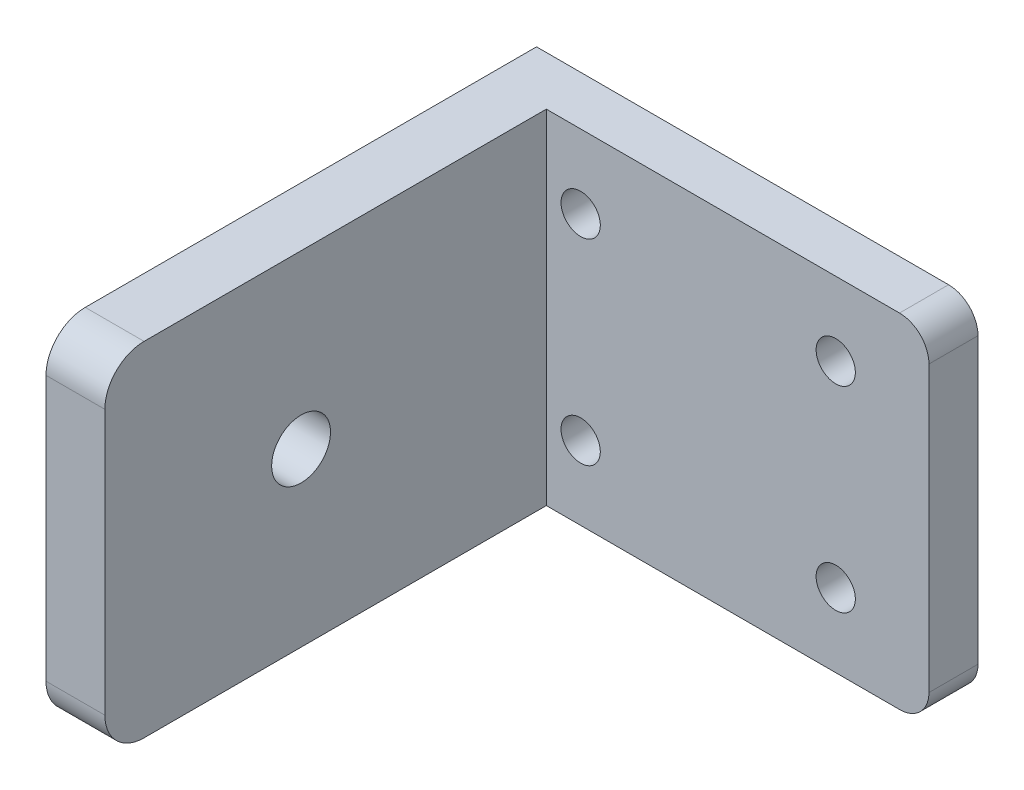
ISO-10303-21;
HEADER;
FILE_DESCRIPTION(('STEP AP214'),'2;1');
FILE_NAME('part.step','',(''),(''),'','','');
FILE_SCHEMA(('AUTOMOTIVE_DESIGN { 1 0 10303 214 1 1 1 1 }'));
ENDSEC;
DATA;
#1=APPLICATION_CONTEXT('core data for automotive mechanical design processes');
#2=APPLICATION_PROTOCOL_DEFINITION('international standard','automotive_design',2000,#1);
#3=PRODUCT_CONTEXT('',#1,'mechanical');
#4=PRODUCT('Part','Part','',(#3));
#5=PRODUCT_RELATED_PRODUCT_CATEGORY('part','',(#4));
#6=PRODUCT_DEFINITION_FORMATION('','',#4);
#7=PRODUCT_DEFINITION_CONTEXT('part definition',#1,'design');
#8=PRODUCT_DEFINITION('design','',#6,#7);
#9=PRODUCT_DEFINITION_SHAPE('','',#8);
#10=(LENGTH_UNIT() NAMED_UNIT(*) SI_UNIT(.MILLI.,.METRE.));
#11=(NAMED_UNIT(*) PLANE_ANGLE_UNIT() SI_UNIT($,.RADIAN.));
#12=(NAMED_UNIT(*) SI_UNIT($,.STERADIAN.) SOLID_ANGLE_UNIT());
#13=UNCERTAINTY_MEASURE_WITH_UNIT(LENGTH_MEASURE(1.E-05),#10,'distance_accuracy_value','');
#14=(GEOMETRIC_REPRESENTATION_CONTEXT(3) GLOBAL_UNCERTAINTY_ASSIGNED_CONTEXT((#13)) GLOBAL_UNIT_ASSIGNED_CONTEXT((#10,
#11,#12)) REPRESENTATION_CONTEXT('',''));
#15=CARTESIAN_POINT('',(0.,0.,0.));
#16=DIRECTION('',(0.,0.,1.));
#17=DIRECTION('',(1.,0.,0.));
#18=AXIS2_PLACEMENT_3D('',#15,#16,#17);
#19=CARTESIAN_POINT('',(0.,0.,5.));
#20=DIRECTION('',(0.,0.,-1.));
#21=DIRECTION('',(-1.,0.,0.));
#22=AXIS2_PLACEMENT_3D('',#19,#20,#21);
#23=PLANE('',#22);
#24=CARTESIAN_POINT('',(-13.,10.,5.));
#25=DIRECTION('',(0.,0.,-1.));
#26=DIRECTION('',(-1.,0.,0.));
#27=AXIS2_PLACEMENT_3D('',#24,#25,#26);
#28=CIRCLE('',#27,2.);
#29=CARTESIAN_POINT('',(-15.,10.,5.));
#30=VERTEX_POINT('',#29);
#31=EDGE_CURVE('E368',#30,#30,#28,.F.);
#32=ORIENTED_EDGE('',*,*,#31,.F.);
#33=EDGE_LOOP('',(#32));
#34=FACE_BOUND('',#33,.T.);
#35=CARTESIAN_POINT('',(13.,-10.,5.));
#36=DIRECTION('',(0.,0.,-1.));
#37=DIRECTION('',(-1.,0.,0.));
#38=AXIS2_PLACEMENT_3D('',#35,#36,#37);
#39=CIRCLE('',#38,2.);
#40=CARTESIAN_POINT('',(11.,-10.,5.));
#41=VERTEX_POINT('',#40);
#42=EDGE_CURVE('E369',#41,#41,#39,.F.);
#43=ORIENTED_EDGE('',*,*,#42,.F.);
#44=EDGE_LOOP('',(#43));
#45=FACE_BOUND('',#44,.T.);
#46=CARTESIAN_POINT('',(-13.,-10.,5.));
#47=DIRECTION('',(0.,0.,-1.));
#48=DIRECTION('',(-1.,0.,0.));
#49=AXIS2_PLACEMENT_3D('',#46,#47,#48);
#50=CIRCLE('',#49,2.);
#51=CARTESIAN_POINT('',(-15.,-10.,5.));
#52=VERTEX_POINT('',#51);
#53=EDGE_CURVE('E378',#52,#52,#50,.F.);
#54=ORIENTED_EDGE('',*,*,#53,.F.);
#55=EDGE_LOOP('',(#54));
#56=FACE_BOUND('',#55,.T.);
#57=CARTESIAN_POINT('',(13.,10.,5.));
#58=DIRECTION('',(0.,0.,-1.));
#59=DIRECTION('',(-1.,0.,0.));
#60=AXIS2_PLACEMENT_3D('',#57,#58,#59);
#61=CIRCLE('',#60,2.);
#62=CARTESIAN_POINT('',(11.,10.,5.));
#63=VERTEX_POINT('',#62);
#64=EDGE_CURVE('E356',#63,#63,#61,.F.);
#65=ORIENTED_EDGE('',*,*,#64,.F.);
#66=EDGE_LOOP('',(#65));
#67=FACE_BOUND('',#66,.T.);
#68=DIRECTION('',(1.,0.,0.));
#69=VECTOR('',#68,1.);
#70=CARTESIAN_POINT('',(-22.5,-17.5,5.));
#71=LINE('',#70,#69);
#72=CARTESIAN_POINT('',(-16.5,-17.5,5.));
#73=VERTEX_POINT('',#72);
#74=CARTESIAN_POINT('',(19.5,-17.5,5.));
#75=VERTEX_POINT('',#74);
#76=EDGE_CURVE('E140',#73,#75,#71,.T.);
#77=ORIENTED_EDGE('',*,*,#76,.T.);
#78=CARTESIAN_POINT('',(19.5,-14.5,5.));
#79=DIRECTION('',(0.,0.,-1.));
#80=DIRECTION('',(-1.,0.,0.));
#81=AXIS2_PLACEMENT_3D('',#78,#79,#80);
#82=CIRCLE('',#81,3.);
#83=CARTESIAN_POINT('',(22.5,-14.5,5.));
#84=VERTEX_POINT('',#83);
#85=EDGE_CURVE('E186',#75,#84,#82,.F.);
#86=ORIENTED_EDGE('',*,*,#85,.T.);
#87=DIRECTION('',(0.,1.,0.));
#88=VECTOR('',#87,1.);
#89=CARTESIAN_POINT('',(22.5,-17.5,5.));
#90=LINE('',#89,#88);
#91=CARTESIAN_POINT('',(22.5,14.5,5.));
#92=VERTEX_POINT('',#91);
#93=EDGE_CURVE('E141',#84,#92,#90,.T.);
#94=ORIENTED_EDGE('',*,*,#93,.T.);
#95=CARTESIAN_POINT('',(19.5,14.5,5.));
#96=DIRECTION('',(0.,0.,-1.));
#97=DIRECTION('',(-1.,0.,0.));
#98=AXIS2_PLACEMENT_3D('',#95,#96,#97);
#99=CIRCLE('',#98,3.);
#100=CARTESIAN_POINT('',(19.5,17.5,5.));
#101=VERTEX_POINT('',#100);
#102=EDGE_CURVE('E139',#92,#101,#99,.F.);
#103=ORIENTED_EDGE('',*,*,#102,.T.);
#104=DIRECTION('',(-1.,0.,0.));
#105=VECTOR('',#104,1.);
#106=CARTESIAN_POINT('',(-22.5,17.5,5.));
#107=LINE('',#106,#105);
#108=CARTESIAN_POINT('',(-16.5,17.5,5.));
#109=VERTEX_POINT('',#108);
#110=EDGE_CURVE('E123',#101,#109,#107,.T.);
#111=ORIENTED_EDGE('',*,*,#110,.T.);
#112=DIRECTION('',(0.,1.,0.));
#113=VECTOR('',#112,1.);
#114=CARTESIAN_POINT('',(-16.5,17.5,5.));
#115=LINE('',#114,#113);
#116=EDGE_CURVE('E135',#73,#109,#115,.T.);
#117=ORIENTED_EDGE('',*,*,#116,.F.);
#118=EDGE_LOOP('',(#77,#86,#94,#103,#111,#117));
#119=FACE_BOUND('',#118,.T.);
#120=ADVANCED_FACE('F42',(#34,#45,#56,#67,#119),#23,.F.);
#121=CARTESIAN_POINT('',(22.5,-17.5,5.));
#122=DIRECTION('',(-1.,0.,0.));
#123=DIRECTION('',(0.,-1.,0.));
#124=AXIS2_PLACEMENT_3D('',#121,#122,#123);
#125=PLANE('',#124);
#126=ORIENTED_EDGE('',*,*,#93,.F.);
#127=DIRECTION('',(0.,0.,-1.));
#128=VECTOR('',#127,1.);
#129=CARTESIAN_POINT('',(22.5,-14.5,5.));
#130=LINE('',#129,#128);
#131=CARTESIAN_POINT('',(22.5,-14.5,0.));
#132=VERTEX_POINT('',#131);
#133=EDGE_CURVE('E176',#84,#132,#130,.T.);
#134=ORIENTED_EDGE('',*,*,#133,.T.);
#135=DIRECTION('',(0.,1.,0.));
#136=VECTOR('',#135,1.);
#137=CARTESIAN_POINT('',(22.5,-17.5,0.));
#138=LINE('',#137,#136);
#139=CARTESIAN_POINT('',(22.5,14.5,0.));
#140=VERTEX_POINT('',#139);
#141=EDGE_CURVE('E156',#132,#140,#138,.T.);
#142=ORIENTED_EDGE('',*,*,#141,.T.);
#143=DIRECTION('',(0.,0.,-1.));
#144=VECTOR('',#143,1.);
#145=CARTESIAN_POINT('',(22.5,14.5,5.));
#146=LINE('',#145,#144);
#147=EDGE_CURVE('E173',#140,#92,#146,.F.);
#148=ORIENTED_EDGE('',*,*,#147,.T.);
#149=EDGE_LOOP('',(#126,#134,#142,#148));
#150=FACE_BOUND('',#149,.T.);
#151=ADVANCED_FACE('F219',(#150),#125,.F.);
#152=CARTESIAN_POINT('',(-22.5,17.5,5.));
#153=DIRECTION('',(0.,-1.,0.));
#154=DIRECTION('',(1.,0.,0.));
#155=AXIS2_PLACEMENT_3D('',#152,#153,#154);
#156=PLANE('',#155);
#157=DIRECTION('',(0.,0.,-1.));
#158=VECTOR('',#157,1.);
#159=CARTESIAN_POINT('',(-22.5,17.5,5.));
#160=LINE('',#159,#158);
#161=CARTESIAN_POINT('',(-22.5,17.5,46.));
#162=VERTEX_POINT('',#161);
#163=CARTESIAN_POINT('',(-22.5,17.5,0.));
#164=VERTEX_POINT('',#163);
#165=EDGE_CURVE('E172',#162,#164,#160,.T.);
#166=ORIENTED_EDGE('',*,*,#165,.F.);
#167=DIRECTION('',(-1.,0.,0.));
#168=VECTOR('',#167,1.);
#169=CARTESIAN_POINT('',(-16.5,17.5,46.));
#170=LINE('',#169,#168);
#171=CARTESIAN_POINT('',(-16.5,17.5,46.));
#172=VERTEX_POINT('',#171);
#173=EDGE_CURVE('E11',#162,#172,#170,.F.);
#174=ORIENTED_EDGE('',*,*,#173,.T.);
#175=DIRECTION('',(0.,0.,-1.));
#176=VECTOR('',#175,1.);
#177=CARTESIAN_POINT('',(-16.5,17.5,50.));
#178=LINE('',#177,#176);
#179=EDGE_CURVE('E119',#172,#109,#178,.T.);
#180=ORIENTED_EDGE('',*,*,#179,.T.);
#181=ORIENTED_EDGE('',*,*,#110,.F.);
#182=DIRECTION('',(0.,0.,-1.));
#183=VECTOR('',#182,1.);
#184=CARTESIAN_POINT('',(19.5,17.5,5.));
#185=LINE('',#184,#183);
#186=CARTESIAN_POINT('',(19.5,17.5,0.));
#187=VERTEX_POINT('',#186);
#188=EDGE_CURVE('E188',#101,#187,#185,.T.);
#189=ORIENTED_EDGE('',*,*,#188,.T.);
#190=DIRECTION('',(-1.,0.,0.));
#191=VECTOR('',#190,1.);
#192=CARTESIAN_POINT('',(-22.5,17.5,0.));
#193=LINE('',#192,#191);
#194=EDGE_CURVE('E163',#187,#164,#193,.T.);
#195=ORIENTED_EDGE('',*,*,#194,.T.);
#196=EDGE_LOOP('',(#166,#174,#180,#181,#189,#195));
#197=FACE_BOUND('',#196,.T.);
#198=ADVANCED_FACE('F121',(#197),#156,.F.);
#199=CARTESIAN_POINT('',(-22.5,-17.5,5.));
#200=DIRECTION('',(1.,0.,0.));
#201=DIRECTION('',(0.,0.,-1.));
#202=AXIS2_PLACEMENT_3D('',#199,#200,#201);
#203=PLANE('',#202);
#204=CARTESIAN_POINT('',(-22.5,0.,30.));
#205=DIRECTION('',(-1.,0.,0.));
#206=DIRECTION('',(0.,0.,1.));
#207=AXIS2_PLACEMENT_3D('',#204,#205,#206);
#208=CIRCLE('',#207,3.);
#209=CARTESIAN_POINT('',(-22.5,0.,33.));
#210=VERTEX_POINT('',#209);
#211=EDGE_CURVE('E151',#210,#210,#208,.T.);
#212=ORIENTED_EDGE('',*,*,#211,.F.);
#213=EDGE_LOOP('',(#212));
#214=FACE_BOUND('',#213,.T.);
#215=DIRECTION('',(0.,0.,-1.));
#216=VECTOR('',#215,1.);
#217=CARTESIAN_POINT('',(-22.5,-17.5,5.));
#218=LINE('',#217,#216);
#219=CARTESIAN_POINT('',(-22.5,-17.5,46.));
#220=VERTEX_POINT('',#219);
#221=CARTESIAN_POINT('',(-22.5,-17.5,0.));
#222=VERTEX_POINT('',#221);
#223=EDGE_CURVE('E160',#220,#222,#218,.T.);
#224=ORIENTED_EDGE('',*,*,#223,.F.);
#225=CARTESIAN_POINT('',(-22.5,-13.5,46.));
#226=DIRECTION('',(1.,0.,0.));
#227=DIRECTION('',(0.,0.,-1.));
#228=AXIS2_PLACEMENT_3D('',#225,#226,#227);
#229=CIRCLE('',#228,4.);
#230=CARTESIAN_POINT('',(-22.5,-13.5,50.));
#231=VERTEX_POINT('',#230);
#232=EDGE_CURVE('E50',#220,#231,#229,.F.);
#233=ORIENTED_EDGE('',*,*,#232,.T.);
#234=DIRECTION('',(0.,-1.,0.));
#235=VECTOR('',#234,1.);
#236=CARTESIAN_POINT('',(-22.5,17.5,50.));
#237=LINE('',#236,#235);
#238=CARTESIAN_POINT('',(-22.5,13.5,50.));
#239=VERTEX_POINT('',#238);
#240=EDGE_CURVE('E145',#239,#231,#237,.T.);
#241=ORIENTED_EDGE('',*,*,#240,.F.);
#242=CARTESIAN_POINT('',(-22.5,13.5,46.));
#243=DIRECTION('',(1.,0.,0.));
#244=DIRECTION('',(0.,0.,-1.));
#245=AXIS2_PLACEMENT_3D('',#242,#243,#244);
#246=CIRCLE('',#245,4.);
#247=EDGE_CURVE('E57',#239,#162,#246,.F.);
#248=ORIENTED_EDGE('',*,*,#247,.T.);
#249=ORIENTED_EDGE('',*,*,#165,.T.);
#250=DIRECTION('',(0.,-1.,0.));
#251=VECTOR('',#250,1.);
#252=CARTESIAN_POINT('',(-22.5,-17.5,0.));
#253=LINE('',#252,#251);
#254=EDGE_CURVE('E166',#164,#222,#253,.T.);
#255=ORIENTED_EDGE('',*,*,#254,.T.);
#256=EDGE_LOOP('',(#224,#233,#241,#248,#249,#255));
#257=FACE_BOUND('',#256,.T.);
#258=ADVANCED_FACE('F202',(#214,#257),#203,.F.);
#259=CARTESIAN_POINT('',(-22.5,-17.5,5.));
#260=DIRECTION('',(0.,1.,0.));
#261=DIRECTION('',(-1.,0.,0.));
#262=AXIS2_PLACEMENT_3D('',#259,#260,#261);
#263=PLANE('',#262);
#264=DIRECTION('',(0.,0.,-1.));
#265=VECTOR('',#264,1.);
#266=CARTESIAN_POINT('',(-16.5,-17.5,50.));
#267=LINE('',#266,#265);
#268=CARTESIAN_POINT('',(-16.5,-17.5,46.));
#269=VERTEX_POINT('',#268);
#270=EDGE_CURVE('E129',#269,#73,#267,.T.);
#271=ORIENTED_EDGE('',*,*,#270,.F.);
#272=DIRECTION('',(1.,0.,0.));
#273=VECTOR('',#272,1.);
#274=CARTESIAN_POINT('',(-22.5,-17.5,46.));
#275=LINE('',#274,#273);
#276=EDGE_CURVE('E65',#269,#220,#275,.F.);
#277=ORIENTED_EDGE('',*,*,#276,.T.);
#278=ORIENTED_EDGE('',*,*,#223,.T.);
#279=DIRECTION('',(1.,0.,0.));
#280=VECTOR('',#279,1.);
#281=CARTESIAN_POINT('',(-22.5,-17.5,0.));
#282=LINE('',#281,#280);
#283=CARTESIAN_POINT('',(19.5,-17.5,0.));
#284=VERTEX_POINT('',#283);
#285=EDGE_CURVE('E157',#222,#284,#282,.T.);
#286=ORIENTED_EDGE('',*,*,#285,.T.);
#287=DIRECTION('',(0.,0.,-1.));
#288=VECTOR('',#287,1.);
#289=CARTESIAN_POINT('',(19.5,-17.5,5.));
#290=LINE('',#289,#288);
#291=EDGE_CURVE('E183',#284,#75,#290,.F.);
#292=ORIENTED_EDGE('',*,*,#291,.T.);
#293=ORIENTED_EDGE('',*,*,#76,.F.);
#294=EDGE_LOOP('',(#271,#277,#278,#286,#292,#293));
#295=FACE_BOUND('',#294,.T.);
#296=ADVANCED_FACE('F210',(#295),#263,.F.);
#297=CARTESIAN_POINT('',(0.,0.,0.));
#298=DIRECTION('',(0.,0.,-1.));
#299=DIRECTION('',(-1.,0.,0.));
#300=AXIS2_PLACEMENT_3D('',#297,#298,#299);
#301=PLANE('',#300);
#302=CARTESIAN_POINT('',(-13.,10.,0.));
#303=DIRECTION('',(0.,0.,-1.));
#304=DIRECTION('',(-1.,0.,0.));
#305=AXIS2_PLACEMENT_3D('',#302,#303,#304);
#306=CIRCLE('',#305,2.);
#307=CARTESIAN_POINT('',(-15.,10.,0.));
#308=VERTEX_POINT('',#307);
#309=EDGE_CURVE('E364',#308,#308,#306,.T.);
#310=ORIENTED_EDGE('',*,*,#309,.F.);
#311=EDGE_LOOP('',(#310));
#312=FACE_BOUND('',#311,.T.);
#313=CARTESIAN_POINT('',(13.,-10.,0.));
#314=DIRECTION('',(0.,0.,-1.));
#315=DIRECTION('',(-1.,0.,0.));
#316=AXIS2_PLACEMENT_3D('',#313,#314,#315);
#317=CIRCLE('',#316,2.);
#318=CARTESIAN_POINT('',(11.,-10.,0.));
#319=VERTEX_POINT('',#318);
#320=EDGE_CURVE('E365',#319,#319,#317,.T.);
#321=ORIENTED_EDGE('',*,*,#320,.F.);
#322=EDGE_LOOP('',(#321));
#323=FACE_BOUND('',#322,.T.);
#324=CARTESIAN_POINT('',(-13.,-10.,0.));
#325=DIRECTION('',(0.,0.,-1.));
#326=DIRECTION('',(-1.,0.,0.));
#327=AXIS2_PLACEMENT_3D('',#324,#325,#326);
#328=CIRCLE('',#327,2.);
#329=CARTESIAN_POINT('',(-15.,-10.,0.));
#330=VERTEX_POINT('',#329);
#331=EDGE_CURVE('E372',#330,#330,#328,.T.);
#332=ORIENTED_EDGE('',*,*,#331,.F.);
#333=EDGE_LOOP('',(#332));
#334=FACE_BOUND('',#333,.T.);
#335=CARTESIAN_POINT('',(13.,10.,0.));
#336=DIRECTION('',(0.,0.,-1.));
#337=DIRECTION('',(-1.,0.,0.));
#338=AXIS2_PLACEMENT_3D('',#335,#336,#337);
#339=CIRCLE('',#338,2.);
#340=CARTESIAN_POINT('',(11.,10.,0.));
#341=VERTEX_POINT('',#340);
#342=EDGE_CURVE('E359',#341,#341,#339,.T.);
#343=ORIENTED_EDGE('',*,*,#342,.F.);
#344=EDGE_LOOP('',(#343));
#345=FACE_BOUND('',#344,.T.);
#346=ORIENTED_EDGE('',*,*,#141,.F.);
#347=CARTESIAN_POINT('',(19.5,-14.5,0.));
#348=DIRECTION('',(0.,0.,-1.));
#349=DIRECTION('',(-1.,0.,0.));
#350=AXIS2_PLACEMENT_3D('',#347,#348,#349);
#351=CIRCLE('',#350,3.);
#352=EDGE_CURVE('E181',#132,#284,#351,.T.);
#353=ORIENTED_EDGE('',*,*,#352,.T.);
#354=ORIENTED_EDGE('',*,*,#285,.F.);
#355=ORIENTED_EDGE('',*,*,#254,.F.);
#356=ORIENTED_EDGE('',*,*,#194,.F.);
#357=CARTESIAN_POINT('',(19.5,14.5,0.));
#358=DIRECTION('',(0.,0.,-1.));
#359=DIRECTION('',(-1.,0.,0.));
#360=AXIS2_PLACEMENT_3D('',#357,#358,#359);
#361=CIRCLE('',#360,3.);
#362=EDGE_CURVE('E179',#187,#140,#361,.T.);
#363=ORIENTED_EDGE('',*,*,#362,.T.);
#364=EDGE_LOOP('',(#346,#353,#354,#355,#356,#363));
#365=FACE_BOUND('',#364,.T.);
#366=ADVANCED_FACE('F222',(#312,#323,#334,#345,#365),#301,.T.);
#367=CARTESIAN_POINT('',(-16.5,17.5,50.));
#368=DIRECTION('',(-1.,0.,0.));
#369=DIRECTION('',(0.,-1.,0.));
#370=AXIS2_PLACEMENT_3D('',#367,#368,#369);
#371=PLANE('',#370);
#372=CARTESIAN_POINT('',(-16.5,0.,30.));
#373=DIRECTION('',(-1.,0.,0.));
#374=DIRECTION('',(0.,-1.,0.));
#375=AXIS2_PLACEMENT_3D('',#372,#373,#374);
#376=CIRCLE('',#375,3.);
#377=CARTESIAN_POINT('',(-16.5,0.,33.));
#378=VERTEX_POINT('',#377);
#379=EDGE_CURVE('E146',#378,#378,#376,.T.);
#380=ORIENTED_EDGE('',*,*,#379,.T.);
#381=EDGE_LOOP('',(#380));
#382=FACE_BOUND('',#381,.T.);
#383=DIRECTION('',(0.,1.,0.));
#384=VECTOR('',#383,1.);
#385=CARTESIAN_POINT('',(-16.5,17.5,50.));
#386=LINE('',#385,#384);
#387=CARTESIAN_POINT('',(-16.5,-13.5,50.));
#388=VERTEX_POINT('',#387);
#389=CARTESIAN_POINT('',(-16.5,13.5,50.));
#390=VERTEX_POINT('',#389);
#391=EDGE_CURVE('E130',#388,#390,#386,.T.);
#392=ORIENTED_EDGE('',*,*,#391,.F.);
#393=CARTESIAN_POINT('',(-16.5,-13.5,46.));
#394=DIRECTION('',(-1.,0.,0.));
#395=DIRECTION('',(0.,-1.,0.));
#396=AXIS2_PLACEMENT_3D('',#393,#394,#395);
#397=CIRCLE('',#396,4.);
#398=EDGE_CURVE('E198',#388,#269,#397,.F.);
#399=ORIENTED_EDGE('',*,*,#398,.T.);
#400=ORIENTED_EDGE('',*,*,#270,.T.);
#401=ORIENTED_EDGE('',*,*,#116,.T.);
#402=ORIENTED_EDGE('',*,*,#179,.F.);
#403=CARTESIAN_POINT('',(-16.5,13.5,46.));
#404=DIRECTION('',(-1.,0.,0.));
#405=DIRECTION('',(0.,-1.,0.));
#406=AXIS2_PLACEMENT_3D('',#403,#404,#405);
#407=CIRCLE('',#406,4.);
#408=EDGE_CURVE('E196',#172,#390,#407,.F.);
#409=ORIENTED_EDGE('',*,*,#408,.T.);
#410=EDGE_LOOP('',(#392,#399,#400,#401,#402,#409));
#411=FACE_BOUND('',#410,.T.);
#412=ADVANCED_FACE('F144',(#382,#411),#371,.F.);
#413=CARTESIAN_POINT('',(0.,0.,50.));
#414=DIRECTION('',(0.,0.,1.));
#415=DIRECTION('',(1.,0.,0.));
#416=AXIS2_PLACEMENT_3D('',#413,#414,#415);
#417=PLANE('',#416);
#418=ORIENTED_EDGE('',*,*,#240,.T.);
#419=DIRECTION('',(1.,0.,0.));
#420=VECTOR('',#419,1.);
#421=CARTESIAN_POINT('',(-16.5,-13.5,50.));
#422=LINE('',#421,#420);
#423=EDGE_CURVE('E193',#231,#388,#422,.T.);
#424=ORIENTED_EDGE('',*,*,#423,.T.);
#425=ORIENTED_EDGE('',*,*,#391,.T.);
#426=DIRECTION('',(-1.,0.,0.));
#427=VECTOR('',#426,1.);
#428=CARTESIAN_POINT('',(-22.5,13.5,50.));
#429=LINE('',#428,#427);
#430=EDGE_CURVE('E190',#390,#239,#429,.T.);
#431=ORIENTED_EDGE('',*,*,#430,.T.);
#432=EDGE_LOOP('',(#418,#424,#425,#431));
#433=FACE_BOUND('',#432,.T.);
#434=ADVANCED_FACE('F206',(#433),#417,.T.);
#435=CARTESIAN_POINT('',(22.5,0.,30.));
#436=DIRECTION('',(-1.,0.,0.));
#437=DIRECTION('',(0.,0.,1.));
#438=AXIS2_PLACEMENT_3D('',#435,#436,#437);
#439=CYLINDRICAL_SURFACE('',#438,3.);
#440=CARTESIAN_POINT('',(-22.5,0.,33.));
#441=CARTESIAN_POINT('',(-22.4375,0.,33.));
#442=CARTESIAN_POINT('',(-22.375,0.,33.));
#443=CARTESIAN_POINT('',(-22.25,0.,33.));
#444=CARTESIAN_POINT('',(-22.1875,0.,33.));
#445=CARTESIAN_POINT('',(-22.0625,0.,33.));
#446=CARTESIAN_POINT('',(-22.,0.,33.));
#447=CARTESIAN_POINT('',(-21.875,0.,33.));
#448=CARTESIAN_POINT('',(-21.8125,0.,33.));
#449=CARTESIAN_POINT('',(-21.6875,0.,33.));
#450=CARTESIAN_POINT('',(-21.625,0.,33.));
#451=CARTESIAN_POINT('',(-21.5,0.,33.));
#452=CARTESIAN_POINT('',(-21.4375,0.,33.));
#453=CARTESIAN_POINT('',(-21.3125,0.,33.));
#454=CARTESIAN_POINT('',(-21.25,0.,33.));
#455=CARTESIAN_POINT('',(-21.125,0.,33.));
#456=CARTESIAN_POINT('',(-21.0625,0.,33.));
#457=CARTESIAN_POINT('',(-20.9375,0.,33.));
#458=CARTESIAN_POINT('',(-20.875,0.,33.));
#459=CARTESIAN_POINT('',(-20.75,0.,33.));
#460=CARTESIAN_POINT('',(-20.6875,0.,33.));
#461=CARTESIAN_POINT('',(-20.5625,0.,33.));
#462=CARTESIAN_POINT('',(-20.5,0.,33.));
#463=CARTESIAN_POINT('',(-20.375,0.,33.));
#464=CARTESIAN_POINT('',(-20.3125,0.,33.));
#465=CARTESIAN_POINT('',(-20.1875,0.,33.));
#466=CARTESIAN_POINT('',(-20.125,0.,33.));
#467=CARTESIAN_POINT('',(-20.,0.,33.));
#468=CARTESIAN_POINT('',(-19.9375,0.,33.));
#469=CARTESIAN_POINT('',(-19.8125,0.,33.));
#470=CARTESIAN_POINT('',(-19.75,0.,33.));
#471=CARTESIAN_POINT('',(-19.625,0.,33.));
#472=CARTESIAN_POINT('',(-19.5625,0.,33.));
#473=CARTESIAN_POINT('',(-19.4375,0.,33.));
#474=CARTESIAN_POINT('',(-19.375,0.,33.));
#475=CARTESIAN_POINT('',(-19.25,0.,33.));
#476=CARTESIAN_POINT('',(-19.1875,0.,33.));
#477=CARTESIAN_POINT('',(-19.0625,0.,33.));
#478=CARTESIAN_POINT('',(-19.,0.,33.));
#479=CARTESIAN_POINT('',(-18.875,0.,33.));
#480=CARTESIAN_POINT('',(-18.8125,0.,33.));
#481=CARTESIAN_POINT('',(-18.6875,0.,33.));
#482=CARTESIAN_POINT('',(-18.625,0.,33.));
#483=CARTESIAN_POINT('',(-18.5,0.,33.));
#484=CARTESIAN_POINT('',(-18.4375,0.,33.));
#485=CARTESIAN_POINT('',(-18.3125,0.,33.));
#486=CARTESIAN_POINT('',(-18.25,0.,33.));
#487=CARTESIAN_POINT('',(-18.125,0.,33.));
#488=CARTESIAN_POINT('',(-18.0625,0.,33.));
#489=CARTESIAN_POINT('',(-17.9375,0.,33.));
#490=CARTESIAN_POINT('',(-17.875,0.,33.));
#491=CARTESIAN_POINT('',(-17.75,0.,33.));
#492=CARTESIAN_POINT('',(-17.6875,0.,33.));
#493=CARTESIAN_POINT('',(-17.5625,0.,33.));
#494=CARTESIAN_POINT('',(-17.5,0.,33.));
#495=CARTESIAN_POINT('',(-17.375,0.,33.));
#496=CARTESIAN_POINT('',(-17.3125,0.,33.));
#497=CARTESIAN_POINT('',(-17.1875,0.,33.));
#498=CARTESIAN_POINT('',(-17.125,0.,33.));
#499=CARTESIAN_POINT('',(-17.,0.,33.));
#500=CARTESIAN_POINT('',(-16.9375,0.,33.));
#501=CARTESIAN_POINT('',(-16.8125,0.,33.));
#502=CARTESIAN_POINT('',(-16.75,0.,33.));
#503=CARTESIAN_POINT('',(-16.625,0.,33.));
#504=CARTESIAN_POINT('',(-16.5625,0.,33.));
#505=CARTESIAN_POINT('',(-16.5,0.,33.));
#506=B_SPLINE_CURVE_WITH_KNOTS('',3,(#440,#441,#442,#443,#444,#445,#446,#447,#448,#449,#450,
#451,#452,#453,#454,#455,#456,#457,#458,#459,#460,#461,#462,#463,#464,#465,#466,#467,#468,#469,
#470,#471,#472,#473,#474,#475,#476,#477,#478,#479,#480,#481,#482,#483,#484,#485,#486,#487,#488,
#489,#490,#491,#492,#493,#494,#495,#496,#497,#498,#499,#500,#501,#502,#503,#504,#505),
.UNSPECIFIED.,.F.,.F.,(4,2,2,2,2,2,2,2,2,2,2,2,2,2,2,2,2,2,2,2,2,2,2,2,2,2,2,2,2,2,2,2,4),(0.,
0.1875,0.375,0.5625,0.750000000000001,0.937500000000001,1.125,1.3125,1.5,1.6875,1.875,2.0625,
2.25,2.4375,2.625,2.8125,3.,3.1875,3.375,3.5625,3.75,3.9375,4.125,4.3125,4.5,4.6875,4.875,
5.0625,5.25,5.4375,5.62500000000001,5.81250000000001,6.00000000000001),.UNSPECIFIED.);
#507=EDGE_CURVE('BSEAM262',#210,#378,#506,.T.);
#508=ORIENTED_EDGE('',*,*,#211,.T.);
#509=ORIENTED_EDGE('',*,*,#379,.F.);
#510=ORIENTED_EDGE('',*,*,#507,.T.);
#511=ORIENTED_EDGE('',*,*,#507,.F.);
#512=EDGE_LOOP('',(#508,#510,#509,#511));
#513=FACE_BOUND('',#512,.T.);
#514=ADVANCED_FACE('F262',(#513),#439,.F.);
#515=CARTESIAN_POINT('',(19.5,-14.5,5.));
#516=DIRECTION('',(0.,0.,-1.));
#517=DIRECTION('',(-1.,0.,0.));
#518=AXIS2_PLACEMENT_3D('',#515,#516,#517);
#519=CYLINDRICAL_SURFACE('',#518,3.);
#520=ORIENTED_EDGE('',*,*,#85,.F.);
#521=ORIENTED_EDGE('',*,*,#291,.F.);
#522=ORIENTED_EDGE('',*,*,#352,.F.);
#523=ORIENTED_EDGE('',*,*,#133,.F.);
#524=EDGE_LOOP('',(#520,#521,#522,#523));
#525=FACE_BOUND('',#524,.T.);
#526=ADVANCED_FACE('F216',(#525),#519,.T.);
#527=CARTESIAN_POINT('',(19.5,14.5,5.));
#528=DIRECTION('',(0.,0.,-1.));
#529=DIRECTION('',(-1.,0.,0.));
#530=AXIS2_PLACEMENT_3D('',#527,#528,#529);
#531=CYLINDRICAL_SURFACE('',#530,3.);
#532=ORIENTED_EDGE('',*,*,#102,.F.);
#533=ORIENTED_EDGE('',*,*,#147,.F.);
#534=ORIENTED_EDGE('',*,*,#362,.F.);
#535=ORIENTED_EDGE('',*,*,#188,.F.);
#536=EDGE_LOOP('',(#532,#533,#534,#535));
#537=FACE_BOUND('',#536,.T.);
#538=ADVANCED_FACE('F227',(#537),#531,.T.);
#539=CARTESIAN_POINT('',(0.,-13.5,46.));
#540=DIRECTION('',(-1.,0.,0.));
#541=DIRECTION('',(0.,-1.,0.));
#542=AXIS2_PLACEMENT_3D('',#539,#540,#541);
#543=CYLINDRICAL_SURFACE('',#542,4.);
#544=ORIENTED_EDGE('',*,*,#232,.F.);
#545=ORIENTED_EDGE('',*,*,#276,.F.);
#546=ORIENTED_EDGE('',*,*,#398,.F.);
#547=ORIENTED_EDGE('',*,*,#423,.F.);
#548=EDGE_LOOP('',(#544,#545,#546,#547));
#549=FACE_BOUND('',#548,.T.);
#550=ADVANCED_FACE('F209',(#549),#543,.T.);
#551=CARTESIAN_POINT('',(0.,13.5,46.));
#552=DIRECTION('',(1.,0.,0.));
#553=DIRECTION('',(0.,1.,0.));
#554=AXIS2_PLACEMENT_3D('',#551,#552,#553);
#555=CYLINDRICAL_SURFACE('',#554,4.);
#556=ORIENTED_EDGE('',*,*,#408,.F.);
#557=ORIENTED_EDGE('',*,*,#173,.F.);
#558=ORIENTED_EDGE('',*,*,#247,.F.);
#559=ORIENTED_EDGE('',*,*,#430,.F.);
#560=EDGE_LOOP('',(#556,#557,#558,#559));
#561=FACE_BOUND('',#560,.T.);
#562=ADVANCED_FACE('F44',(#561),#555,.T.);
#563=CARTESIAN_POINT('',(13.,10.,50.001));
#564=DIRECTION('',(0.,0.,-1.));
#565=DIRECTION('',(-1.,0.,0.));
#566=AXIS2_PLACEMENT_3D('',#563,#564,#565);
#567=CYLINDRICAL_SURFACE('',#566,2.);
#568=ORIENTED_EDGE('',*,*,#342,.T.);
#569=EDGE_LOOP('',(#568));
#570=FACE_BOUND('',#569,.T.);
#571=ORIENTED_EDGE('',*,*,#64,.T.);
#572=EDGE_LOOP('',(#571));
#573=FACE_BOUND('',#572,.T.);
#574=ADVANCED_FACE('F230',(#570,#573),#567,.F.);
#575=CARTESIAN_POINT('',(-13.,-10.,50.001));
#576=DIRECTION('',(0.,0.,-1.));
#577=DIRECTION('',(-1.,0.,0.));
#578=AXIS2_PLACEMENT_3D('',#575,#576,#577);
#579=CYLINDRICAL_SURFACE('',#578,2.);
#580=ORIENTED_EDGE('',*,*,#331,.T.);
#581=EDGE_LOOP('',(#580));
#582=FACE_BOUND('',#581,.T.);
#583=ORIENTED_EDGE('',*,*,#53,.T.);
#584=EDGE_LOOP('',(#583));
#585=FACE_BOUND('',#584,.T.);
#586=ADVANCED_FACE('F236',(#582,#585),#579,.F.);
#587=CARTESIAN_POINT('',(13.,-10.,50.001));
#588=DIRECTION('',(0.,0.,-1.));
#589=DIRECTION('',(-1.,0.,0.));
#590=AXIS2_PLACEMENT_3D('',#587,#588,#589);
#591=CYLINDRICAL_SURFACE('',#590,2.);
#592=ORIENTED_EDGE('',*,*,#320,.T.);
#593=EDGE_LOOP('',(#592));
#594=FACE_BOUND('',#593,.T.);
#595=ORIENTED_EDGE('',*,*,#42,.T.);
#596=EDGE_LOOP('',(#595));
#597=FACE_BOUND('',#596,.T.);
#598=ADVANCED_FACE('F323',(#594,#597),#591,.F.);
#599=CARTESIAN_POINT('',(-13.,10.,50.001));
#600=DIRECTION('',(0.,0.,-1.));
#601=DIRECTION('',(-1.,0.,0.));
#602=AXIS2_PLACEMENT_3D('',#599,#600,#601);
#603=CYLINDRICAL_SURFACE('',#602,2.);
#604=ORIENTED_EDGE('',*,*,#309,.T.);
#605=EDGE_LOOP('',(#604));
#606=FACE_BOUND('',#605,.T.);
#607=ORIENTED_EDGE('',*,*,#31,.T.);
#608=EDGE_LOOP('',(#607));
#609=FACE_BOUND('',#608,.T.);
#610=ADVANCED_FACE('F333',(#606,#609),#603,.F.);
#611=CLOSED_SHELL('',(#120,#151,#198,#258,#296,#366,#412,#434,#514,#526,#538,#550,#562,#574,
#586,#598,#610));
#612=MANIFOLD_SOLID_BREP('B2',#611);
#613=ADVANCED_BREP_SHAPE_REPRESENTATION('',(#18,#612),#14);
#614=SHAPE_DEFINITION_REPRESENTATION(#9,#613);
ENDSEC;
END-ISO-10303-21;
